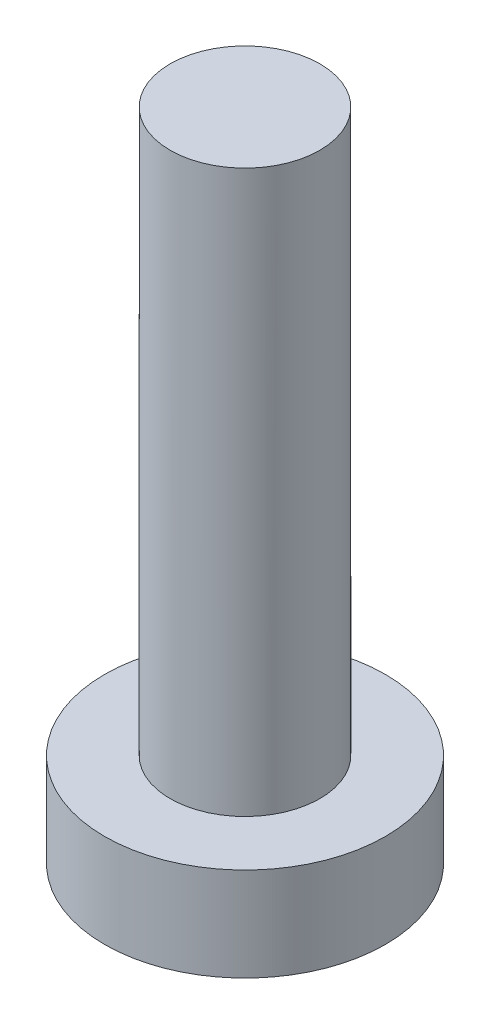
ISO-10303-21;
HEADER;
FILE_DESCRIPTION(('STEP AP214'),'2;1');
FILE_NAME('part.step','',(''),(''),'','','');
FILE_SCHEMA(('AUTOMOTIVE_DESIGN { 1 0 10303 214 1 1 1 1 }'));
ENDSEC;
DATA;
#1=APPLICATION_CONTEXT('core data for automotive mechanical design processes');
#2=APPLICATION_PROTOCOL_DEFINITION('international standard','automotive_design',2000,#1);
#3=PRODUCT_CONTEXT('',#1,'mechanical');
#4=PRODUCT('Part','Part','',(#3));
#5=PRODUCT_RELATED_PRODUCT_CATEGORY('part','',(#4));
#6=PRODUCT_DEFINITION_FORMATION('','',#4);
#7=PRODUCT_DEFINITION_CONTEXT('part definition',#1,'design');
#8=PRODUCT_DEFINITION('design','',#6,#7);
#9=PRODUCT_DEFINITION_SHAPE('','',#8);
#10=(LENGTH_UNIT() NAMED_UNIT(*) SI_UNIT(.MILLI.,.METRE.));
#11=(NAMED_UNIT(*) PLANE_ANGLE_UNIT() SI_UNIT($,.RADIAN.));
#12=(NAMED_UNIT(*) SI_UNIT($,.STERADIAN.) SOLID_ANGLE_UNIT());
#13=UNCERTAINTY_MEASURE_WITH_UNIT(LENGTH_MEASURE(1.E-05),#10,'distance_accuracy_value','');
#14=(GEOMETRIC_REPRESENTATION_CONTEXT(3) GLOBAL_UNCERTAINTY_ASSIGNED_CONTEXT((#13)) GLOBAL_UNIT_ASSIGNED_CONTEXT((#10,
#11,#12)) REPRESENTATION_CONTEXT('',''));
#15=CARTESIAN_POINT('',(0.,0.,0.));
#16=DIRECTION('',(0.,0.,1.));
#17=DIRECTION('',(1.,0.,0.));
#18=AXIS2_PLACEMENT_3D('',#15,#16,#17);
#19=CARTESIAN_POINT('',(0.,6.,0.));
#20=DIRECTION('',(0.,-1.,0.));
#21=DIRECTION('',(0.,0.,-1.));
#22=AXIS2_PLACEMENT_3D('',#19,#20,#21);
#23=CYLINDRICAL_SURFACE('',#22,0.8);
#24=CARTESIAN_POINT('',(0.,6.,0.));
#25=DIRECTION('',(0.,1.,0.));
#26=DIRECTION('',(0.,0.,1.));
#27=AXIS2_PLACEMENT_3D('',#24,#25,#26);
#28=CIRCLE('',#27,0.8);
#29=CARTESIAN_POINT('',(0.,6.,0.8));
#30=VERTEX_POINT('',#29);
#31=EDGE_CURVE('E10',#30,#30,#28,.T.);
#32=ORIENTED_EDGE('',*,*,#31,.F.);
#33=EDGE_LOOP('',(#32));
#34=FACE_BOUND('',#33,.T.);
#35=CARTESIAN_POINT('',(0.,0.,0.));
#36=DIRECTION('',(0.,-1.,0.));
#37=DIRECTION('',(0.,0.,-1.));
#38=AXIS2_PLACEMENT_3D('',#35,#36,#37);
#39=CIRCLE('',#38,0.8);
#40=CARTESIAN_POINT('',(0.,0.,-0.8));
#41=VERTEX_POINT('',#40);
#42=EDGE_CURVE('E37',#41,#41,#39,.T.);
#43=ORIENTED_EDGE('',*,*,#42,.F.);
#44=EDGE_LOOP('',(#43));
#45=FACE_BOUND('',#44,.T.);
#46=ADVANCED_FACE('F31',(#34,#45),#23,.T.);
#47=CARTESIAN_POINT('',(0.,6.,0.));
#48=DIRECTION('',(0.,1.,0.));
#49=DIRECTION('',(0.,0.,1.));
#50=AXIS2_PLACEMENT_3D('',#47,#48,#49);
#51=PLANE('',#50);
#52=ORIENTED_EDGE('',*,*,#31,.T.);
#53=EDGE_LOOP('',(#52));
#54=FACE_BOUND('',#53,.T.);
#55=ADVANCED_FACE('F64',(#54),#51,.T.);
#56=CARTESIAN_POINT('',(0.,-1.,0.));
#57=DIRECTION('',(0.,1.,0.));
#58=DIRECTION('',(0.,0.,1.));
#59=AXIS2_PLACEMENT_3D('',#56,#57,#58);
#60=CYLINDRICAL_SURFACE('',#59,1.5);
#61=CARTESIAN_POINT('',(0.,-1.,0.));
#62=DIRECTION('',(0.,-1.,0.));
#63=DIRECTION('',(0.,0.,-1.));
#64=AXIS2_PLACEMENT_3D('',#61,#62,#63);
#65=CIRCLE('',#64,1.5);
#66=CARTESIAN_POINT('',(0.,-1.,-1.5));
#67=VERTEX_POINT('',#66);
#68=EDGE_CURVE('E41',#67,#67,#65,.T.);
#69=ORIENTED_EDGE('',*,*,#68,.F.);
#70=EDGE_LOOP('',(#69));
#71=FACE_BOUND('',#70,.T.);
#72=CARTESIAN_POINT('',(0.,0.,0.));
#73=DIRECTION('',(0.,-1.,0.));
#74=DIRECTION('',(0.,0.,-1.));
#75=AXIS2_PLACEMENT_3D('',#72,#73,#74);
#76=CIRCLE('',#75,1.5);
#77=CARTESIAN_POINT('',(0.,0.,-1.5));
#78=VERTEX_POINT('',#77);
#79=EDGE_CURVE('E45',#78,#78,#76,.T.);
#80=ORIENTED_EDGE('',*,*,#79,.T.);
#81=EDGE_LOOP('',(#80));
#82=FACE_BOUND('',#81,.T.);
#83=ADVANCED_FACE('F51',(#71,#82),#60,.T.);
#84=CARTESIAN_POINT('',(0.,-1.,0.));
#85=DIRECTION('',(0.,-1.,0.));
#86=DIRECTION('',(0.,0.,-1.));
#87=AXIS2_PLACEMENT_3D('',#84,#85,#86);
#88=PLANE('',#87);
#89=ORIENTED_EDGE('',*,*,#68,.T.);
#90=EDGE_LOOP('',(#89));
#91=FACE_BOUND('',#90,.T.);
#92=ADVANCED_FACE('F55',(#91),#88,.T.);
#93=CARTESIAN_POINT('',(0.,0.,0.));
#94=DIRECTION('',(0.,-1.,0.));
#95=DIRECTION('',(0.,0.,-1.));
#96=AXIS2_PLACEMENT_3D('',#93,#94,#95);
#97=PLANE('',#96);
#98=ORIENTED_EDGE('',*,*,#42,.T.);
#99=EDGE_LOOP('',(#98));
#100=FACE_BOUND('',#99,.T.);
#101=ORIENTED_EDGE('',*,*,#79,.F.);
#102=EDGE_LOOP('',(#101));
#103=FACE_BOUND('',#102,.T.);
#104=ADVANCED_FACE('F53',(#100,#103),#97,.F.);
#105=CLOSED_SHELL('',(#46,#55,#83,#92,#104));
#106=MANIFOLD_SOLID_BREP('B2',#105);
#107=ADVANCED_BREP_SHAPE_REPRESENTATION('',(#18,#106),#14);
#108=SHAPE_DEFINITION_REPRESENTATION(#9,#107);
ENDSEC;
END-ISO-10303-21;
